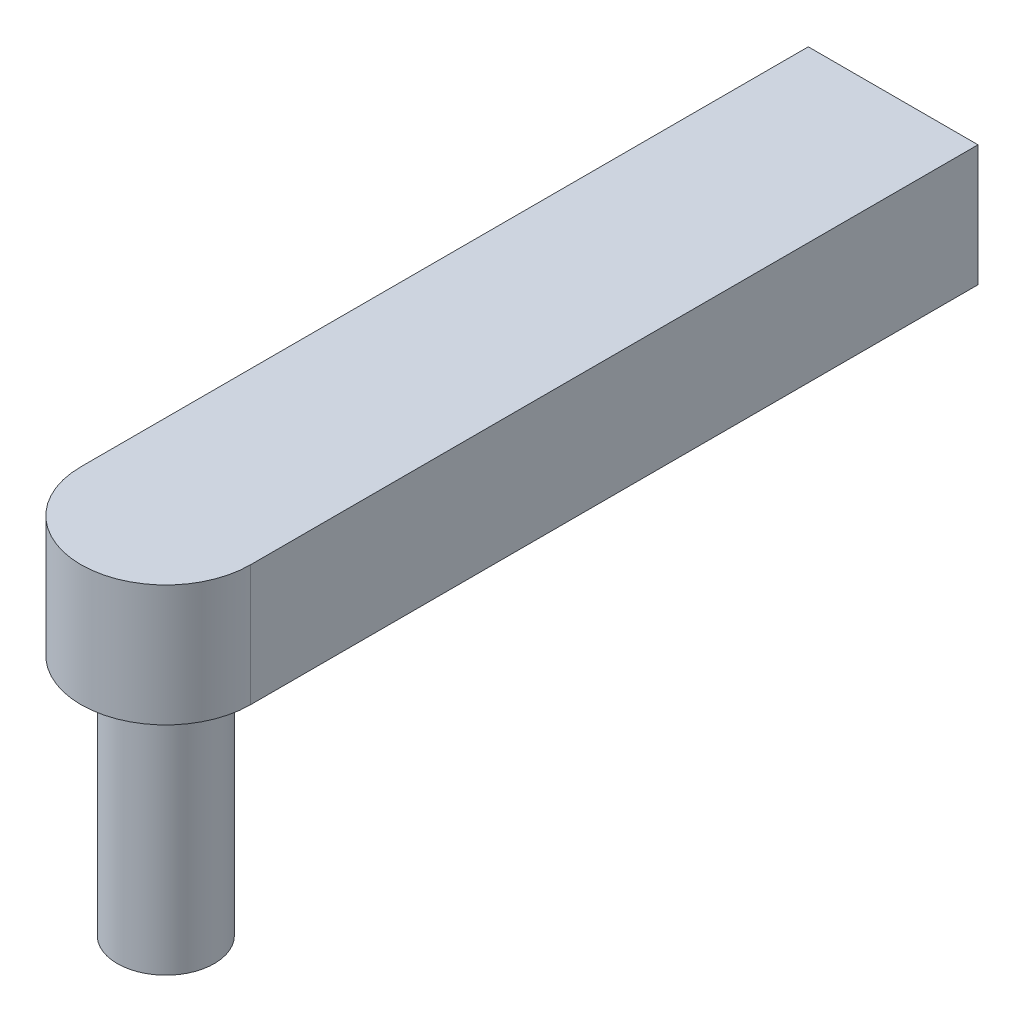
ISO-10303-21;
HEADER;
FILE_DESCRIPTION(('STEP AP214'),'2;1');
FILE_NAME('part.step','',(''),(''),'','','');
FILE_SCHEMA(('AUTOMOTIVE_DESIGN { 1 0 10303 214 1 1 1 1 }'));
ENDSEC;
DATA;
#1=APPLICATION_CONTEXT('core data for automotive mechanical design processes');
#2=APPLICATION_PROTOCOL_DEFINITION('international standard','automotive_design',2000,#1);
#3=PRODUCT_CONTEXT('',#1,'mechanical');
#4=PRODUCT('Part','Part','',(#3));
#5=PRODUCT_RELATED_PRODUCT_CATEGORY('part','',(#4));
#6=PRODUCT_DEFINITION_FORMATION('','',#4);
#7=PRODUCT_DEFINITION_CONTEXT('part definition',#1,'design');
#8=PRODUCT_DEFINITION('design','',#6,#7);
#9=PRODUCT_DEFINITION_SHAPE('','',#8);
#10=(LENGTH_UNIT() NAMED_UNIT(*) SI_UNIT(.MILLI.,.METRE.));
#11=(NAMED_UNIT(*) PLANE_ANGLE_UNIT() SI_UNIT($,.RADIAN.));
#12=(NAMED_UNIT(*) SI_UNIT($,.STERADIAN.) SOLID_ANGLE_UNIT());
#13=UNCERTAINTY_MEASURE_WITH_UNIT(LENGTH_MEASURE(1.E-05),#10,'distance_accuracy_value','');
#14=(GEOMETRIC_REPRESENTATION_CONTEXT(3) GLOBAL_UNCERTAINTY_ASSIGNED_CONTEXT((#13)) GLOBAL_UNIT_ASSIGNED_CONTEXT((#10,
#11,#12)) REPRESENTATION_CONTEXT('',''));
#15=CARTESIAN_POINT('',(0.,0.,0.));
#16=DIRECTION('',(0.,0.,1.));
#17=DIRECTION('',(1.,0.,0.));
#18=AXIS2_PLACEMENT_3D('',#15,#16,#17);
#19=CARTESIAN_POINT('',(0.,10.,0.));
#20=DIRECTION('',(0.,-1.,0.));
#21=DIRECTION('',(0.,0.,-1.));
#22=AXIS2_PLACEMENT_3D('',#19,#20,#21);
#23=CYLINDRICAL_SURFACE('',#22,2.);
#24=CARTESIAN_POINT('',(0.,10.,0.));
#25=DIRECTION('',(0.,1.,0.));
#26=DIRECTION('',(0.,0.,1.));
#27=AXIS2_PLACEMENT_3D('',#24,#25,#26);
#28=CIRCLE('',#27,2.);
#29=CARTESIAN_POINT('',(0.,10.,2.));
#30=VERTEX_POINT('',#29);
#31=EDGE_CURVE('E11',#30,#30,#28,.T.);
#32=ORIENTED_EDGE('',*,*,#31,.F.);
#33=EDGE_LOOP('',(#32));
#34=FACE_BOUND('',#33,.T.);
#35=CARTESIAN_POINT('',(0.,0.,0.));
#36=DIRECTION('',(0.,1.,0.));
#37=DIRECTION('',(0.,0.,1.));
#38=AXIS2_PLACEMENT_3D('',#35,#36,#37);
#39=CIRCLE('',#38,2.);
#40=CARTESIAN_POINT('',(0.,0.,2.));
#41=VERTEX_POINT('',#40);
#42=EDGE_CURVE('E37',#41,#41,#39,.T.);
#43=ORIENTED_EDGE('',*,*,#42,.T.);
#44=EDGE_LOOP('',(#43));
#45=FACE_BOUND('',#44,.T.);
#46=ADVANCED_FACE('F34',(#34,#45),#23,.T.);
#47=CARTESIAN_POINT('',(0.,0.,0.));
#48=DIRECTION('',(0.,1.,0.));
#49=DIRECTION('',(0.,0.,1.));
#50=AXIS2_PLACEMENT_3D('',#47,#48,#49);
#51=PLANE('',#50);
#52=ORIENTED_EDGE('',*,*,#42,.F.);
#53=EDGE_LOOP('',(#52));
#54=FACE_BOUND('',#53,.T.);
#55=ADVANCED_FACE('F113',(#54),#51,.F.);
#56=CARTESIAN_POINT('',(0.,10.,0.));
#57=DIRECTION('',(0.,1.,0.));
#58=DIRECTION('',(0.,0.,1.));
#59=AXIS2_PLACEMENT_3D('',#56,#57,#58);
#60=PLANE('',#59);
#61=CARTESIAN_POINT('',(0.,10.,0.));
#62=DIRECTION('',(0.,1.,0.));
#63=DIRECTION('',(0.,0.,1.));
#64=AXIS2_PLACEMENT_3D('',#61,#62,#63);
#65=CIRCLE('',#64,3.5);
#66=CARTESIAN_POINT('',(-3.5,10.,0.));
#67=VERTEX_POINT('',#66);
#68=CARTESIAN_POINT('',(3.5,10.,0.));
#69=VERTEX_POINT('',#68);
#70=EDGE_CURVE('E101',#67,#69,#65,.T.);
#71=ORIENTED_EDGE('',*,*,#70,.F.);
#72=DIRECTION('',(0.,0.,1.));
#73=VECTOR('',#72,1.);
#74=CARTESIAN_POINT('',(-3.5,10.,0.));
#75=LINE('',#74,#73);
#76=CARTESIAN_POINT('',(-3.5,10.,-30.));
#77=VERTEX_POINT('',#76);
#78=EDGE_CURVE('E73',#77,#67,#75,.T.);
#79=ORIENTED_EDGE('',*,*,#78,.F.);
#80=DIRECTION('',(-1.,0.,0.));
#81=VECTOR('',#80,1.);
#82=CARTESIAN_POINT('',(-3.5,10.,-30.));
#83=LINE('',#82,#81);
#84=CARTESIAN_POINT('',(3.5,10.,-30.));
#85=VERTEX_POINT('',#84);
#86=EDGE_CURVE('E67',#85,#77,#83,.T.);
#87=ORIENTED_EDGE('',*,*,#86,.F.);
#88=DIRECTION('',(0.,0.,-1.));
#89=VECTOR('',#88,1.);
#90=CARTESIAN_POINT('',(3.5,10.,0.));
#91=LINE('',#90,#89);
#92=EDGE_CURVE('E91',#69,#85,#91,.T.);
#93=ORIENTED_EDGE('',*,*,#92,.F.);
#94=EDGE_LOOP('',(#71,#79,#87,#93));
#95=FACE_BOUND('',#94,.T.);
#96=ORIENTED_EDGE('',*,*,#31,.T.);
#97=EDGE_LOOP('',(#96));
#98=FACE_BOUND('',#97,.T.);
#99=ADVANCED_FACE('F115',(#95,#98),#60,.F.);
#100=CARTESIAN_POINT('',(0.,15.,0.));
#101=DIRECTION('',(0.,-1.,0.));
#102=DIRECTION('',(0.,0.,-1.));
#103=AXIS2_PLACEMENT_3D('',#100,#101,#102);
#104=CYLINDRICAL_SURFACE('',#103,3.5);
#105=ORIENTED_EDGE('',*,*,#70,.T.);
#106=DIRECTION('',(0.,-1.,0.));
#107=VECTOR('',#106,1.);
#108=CARTESIAN_POINT('',(3.5,15.,0.));
#109=LINE('',#108,#107);
#110=CARTESIAN_POINT('',(3.5,15.,0.));
#111=VERTEX_POINT('',#110);
#112=EDGE_CURVE('E92',#111,#69,#109,.T.);
#113=ORIENTED_EDGE('',*,*,#112,.F.);
#114=CARTESIAN_POINT('',(0.,15.,0.));
#115=DIRECTION('',(0.,1.,0.));
#116=DIRECTION('',(0.,0.,1.));
#117=AXIS2_PLACEMENT_3D('',#114,#115,#116);
#118=CIRCLE('',#117,3.5);
#119=CARTESIAN_POINT('',(-3.5,15.,0.));
#120=VERTEX_POINT('',#119);
#121=EDGE_CURVE('E86',#120,#111,#118,.T.);
#122=ORIENTED_EDGE('',*,*,#121,.F.);
#123=DIRECTION('',(0.,-1.,0.));
#124=VECTOR('',#123,1.);
#125=CARTESIAN_POINT('',(-3.5,15.,0.));
#126=LINE('',#125,#124);
#127=EDGE_CURVE('E97',#120,#67,#126,.T.);
#128=ORIENTED_EDGE('',*,*,#127,.T.);
#129=EDGE_LOOP('',(#105,#113,#122,#128));
#130=FACE_BOUND('',#129,.T.);
#131=ADVANCED_FACE('F120',(#130),#104,.T.);
#132=CARTESIAN_POINT('',(3.5,15.,0.));
#133=DIRECTION('',(-1.,0.,0.));
#134=DIRECTION('',(0.,0.,1.));
#135=AXIS2_PLACEMENT_3D('',#132,#133,#134);
#136=PLANE('',#135);
#137=ORIENTED_EDGE('',*,*,#92,.T.);
#138=DIRECTION('',(0.,-1.,0.));
#139=VECTOR('',#138,1.);
#140=CARTESIAN_POINT('',(3.5,15.,-30.));
#141=LINE('',#140,#139);
#142=CARTESIAN_POINT('',(3.5,15.,-30.));
#143=VERTEX_POINT('',#142);
#144=EDGE_CURVE('E89',#143,#85,#141,.T.);
#145=ORIENTED_EDGE('',*,*,#144,.F.);
#146=DIRECTION('',(0.,0.,-1.));
#147=VECTOR('',#146,1.);
#148=CARTESIAN_POINT('',(3.5,15.,0.));
#149=LINE('',#148,#147);
#150=EDGE_CURVE('E81',#111,#143,#149,.T.);
#151=ORIENTED_EDGE('',*,*,#150,.F.);
#152=ORIENTED_EDGE('',*,*,#112,.T.);
#153=EDGE_LOOP('',(#137,#145,#151,#152));
#154=FACE_BOUND('',#153,.T.);
#155=ADVANCED_FACE('F90',(#154),#136,.F.);
#156=CARTESIAN_POINT('',(-3.5,15.,-30.));
#157=DIRECTION('',(0.,0.,1.));
#158=DIRECTION('',(1.,0.,0.));
#159=AXIS2_PLACEMENT_3D('',#156,#157,#158);
#160=PLANE('',#159);
#161=ORIENTED_EDGE('',*,*,#86,.T.);
#162=DIRECTION('',(0.,-1.,0.));
#163=VECTOR('',#162,1.);
#164=CARTESIAN_POINT('',(-3.5,15.,-30.));
#165=LINE('',#164,#163);
#166=CARTESIAN_POINT('',(-3.5,15.,-30.));
#167=VERTEX_POINT('',#166);
#168=EDGE_CURVE('E93',#167,#77,#165,.T.);
#169=ORIENTED_EDGE('',*,*,#168,.F.);
#170=DIRECTION('',(-1.,0.,0.));
#171=VECTOR('',#170,1.);
#172=CARTESIAN_POINT('',(-3.5,15.,-30.));
#173=LINE('',#172,#171);
#174=EDGE_CURVE('E84',#143,#167,#173,.T.);
#175=ORIENTED_EDGE('',*,*,#174,.F.);
#176=ORIENTED_EDGE('',*,*,#144,.T.);
#177=EDGE_LOOP('',(#161,#169,#175,#176));
#178=FACE_BOUND('',#177,.T.);
#179=ADVANCED_FACE('F95',(#178),#160,.F.);
#180=CARTESIAN_POINT('',(-3.5,15.,0.));
#181=DIRECTION('',(1.,0.,0.));
#182=DIRECTION('',(0.,0.,-1.));
#183=AXIS2_PLACEMENT_3D('',#180,#181,#182);
#184=PLANE('',#183);
#185=ORIENTED_EDGE('',*,*,#78,.T.);
#186=ORIENTED_EDGE('',*,*,#127,.F.);
#187=DIRECTION('',(0.,0.,1.));
#188=VECTOR('',#187,1.);
#189=CARTESIAN_POINT('',(-3.5,15.,0.));
#190=LINE('',#189,#188);
#191=EDGE_CURVE('E50',#167,#120,#190,.T.);
#192=ORIENTED_EDGE('',*,*,#191,.F.);
#193=ORIENTED_EDGE('',*,*,#168,.T.);
#194=EDGE_LOOP('',(#185,#186,#192,#193));
#195=FACE_BOUND('',#194,.T.);
#196=ADVANCED_FACE('F132',(#195),#184,.F.);
#197=CARTESIAN_POINT('',(0.,15.,0.));
#198=DIRECTION('',(0.,1.,0.));
#199=DIRECTION('',(0.,0.,1.));
#200=AXIS2_PLACEMENT_3D('',#197,#198,#199);
#201=PLANE('',#200);
#202=ORIENTED_EDGE('',*,*,#121,.T.);
#203=ORIENTED_EDGE('',*,*,#150,.T.);
#204=ORIENTED_EDGE('',*,*,#174,.T.);
#205=ORIENTED_EDGE('',*,*,#191,.T.);
#206=EDGE_LOOP('',(#202,#203,#204,#205));
#207=FACE_BOUND('',#206,.T.);
#208=ADVANCED_FACE('F82',(#207),#201,.T.);
#209=CLOSED_SHELL('',(#46,#55,#99,#131,#155,#179,#196,#208));
#210=MANIFOLD_SOLID_BREP('B2',#209);
#211=ADVANCED_BREP_SHAPE_REPRESENTATION('',(#18,#210),#14);
#212=SHAPE_DEFINITION_REPRESENTATION(#9,#211);
ENDSEC;
END-ISO-10303-21;
